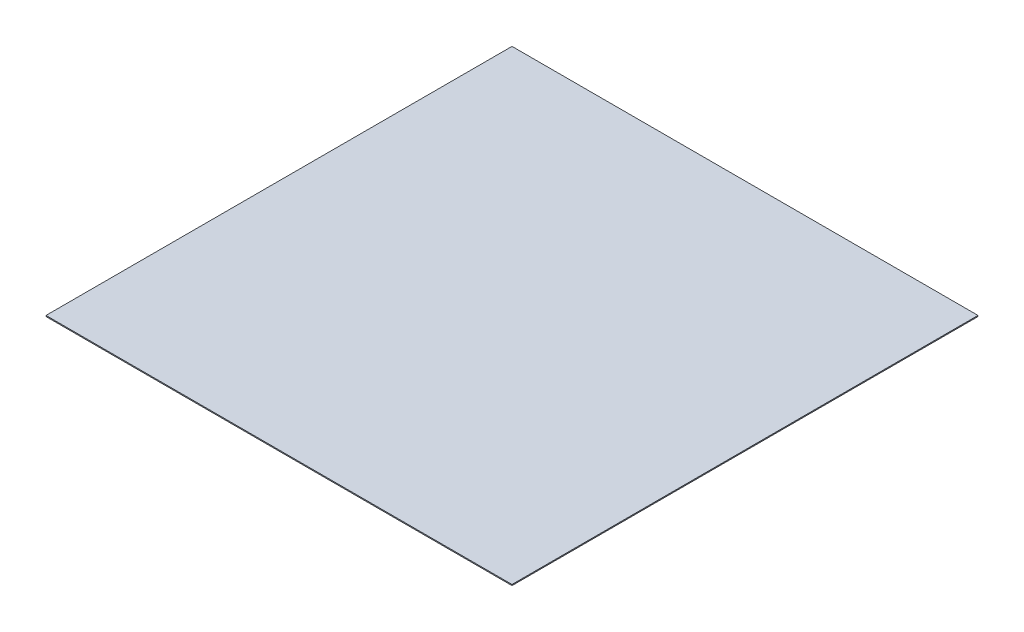
ISO-10303-21;
HEADER;
FILE_DESCRIPTION(('STEP AP214'),'2;1');
FILE_NAME('part.step','',(''),(''),'','','');
FILE_SCHEMA(('AUTOMOTIVE_DESIGN { 1 0 10303 214 1 1 1 1 }'));
ENDSEC;
DATA;
#1=APPLICATION_CONTEXT('core data for automotive mechanical design processes');
#2=APPLICATION_PROTOCOL_DEFINITION('international standard','automotive_design',2000,#1);
#3=PRODUCT_CONTEXT('',#1,'mechanical');
#4=PRODUCT('Part','Part','',(#3));
#5=PRODUCT_RELATED_PRODUCT_CATEGORY('part','',(#4));
#6=PRODUCT_DEFINITION_FORMATION('','',#4);
#7=PRODUCT_DEFINITION_CONTEXT('part definition',#1,'design');
#8=PRODUCT_DEFINITION('design','',#6,#7);
#9=PRODUCT_DEFINITION_SHAPE('','',#8);
#10=(LENGTH_UNIT() NAMED_UNIT(*) SI_UNIT(.MILLI.,.METRE.));
#11=(NAMED_UNIT(*) PLANE_ANGLE_UNIT() SI_UNIT($,.RADIAN.));
#12=(NAMED_UNIT(*) SI_UNIT($,.STERADIAN.) SOLID_ANGLE_UNIT());
#13=UNCERTAINTY_MEASURE_WITH_UNIT(LENGTH_MEASURE(1.E-05),#10,'distance_accuracy_value','');
#14=(GEOMETRIC_REPRESENTATION_CONTEXT(3) GLOBAL_UNCERTAINTY_ASSIGNED_CONTEXT((#13)) GLOBAL_UNIT_ASSIGNED_CONTEXT((#10,
#11,#12)) REPRESENTATION_CONTEXT('',''));
#15=CARTESIAN_POINT('',(0.,0.,0.));
#16=DIRECTION('',(0.,0.,1.));
#17=DIRECTION('',(1.,0.,0.));
#18=AXIS2_PLACEMENT_3D('',#15,#16,#17);
#19=CARTESIAN_POINT('',(57.,0.125,57.));
#20=DIRECTION('',(-1.,0.,0.));
#21=DIRECTION('',(0.,0.,1.));
#22=AXIS2_PLACEMENT_3D('',#19,#20,#21);
#23=PLANE('',#22);
#24=DIRECTION('',(0.,0.,-1.));
#25=VECTOR('',#24,1.);
#26=CARTESIAN_POINT('',(57.,-0.125,57.));
#27=LINE('',#26,#25);
#28=CARTESIAN_POINT('',(57.,-0.125,57.));
#29=VERTEX_POINT('',#28);
#30=CARTESIAN_POINT('',(57.,-0.125,-57.));
#31=VERTEX_POINT('',#30);
#32=EDGE_CURVE('E96',#29,#31,#27,.T.);
#33=ORIENTED_EDGE('',*,*,#32,.T.);
#34=DIRECTION('',(0.,-1.,0.));
#35=VECTOR('',#34,1.);
#36=CARTESIAN_POINT('',(57.,0.125,-57.));
#37=LINE('',#36,#35);
#38=CARTESIAN_POINT('',(57.,0.125,-57.));
#39=VERTEX_POINT('',#38);
#40=EDGE_CURVE('E11',#39,#31,#37,.T.);
#41=ORIENTED_EDGE('',*,*,#40,.F.);
#42=DIRECTION('',(0.,0.,-1.));
#43=VECTOR('',#42,1.);
#44=CARTESIAN_POINT('',(57.,0.125,57.));
#45=LINE('',#44,#43);
#46=CARTESIAN_POINT('',(57.,0.125,57.));
#47=VERTEX_POINT('',#46);
#48=EDGE_CURVE('E84',#47,#39,#45,.T.);
#49=ORIENTED_EDGE('',*,*,#48,.F.);
#50=DIRECTION('',(0.,-1.,0.));
#51=VECTOR('',#50,1.);
#52=CARTESIAN_POINT('',(57.,0.125,57.));
#53=LINE('',#52,#51);
#54=EDGE_CURVE('E92',#47,#29,#53,.T.);
#55=ORIENTED_EDGE('',*,*,#54,.T.);
#56=EDGE_LOOP('',(#33,#41,#49,#55));
#57=FACE_BOUND('',#56,.T.);
#58=ADVANCED_FACE('F33',(#57),#23,.F.);
#59=CARTESIAN_POINT('',(-57.,0.125,-57.));
#60=DIRECTION('',(0.,0.,1.));
#61=DIRECTION('',(1.,0.,0.));
#62=AXIS2_PLACEMENT_3D('',#59,#60,#61);
#63=PLANE('',#62);
#64=DIRECTION('',(-1.,0.,0.));
#65=VECTOR('',#64,1.);
#66=CARTESIAN_POINT('',(-57.,-0.125,-57.));
#67=LINE('',#66,#65);
#68=CARTESIAN_POINT('',(-57.,-0.125,-57.));
#69=VERTEX_POINT('',#68);
#70=EDGE_CURVE('E88',#31,#69,#67,.T.);
#71=ORIENTED_EDGE('',*,*,#70,.T.);
#72=DIRECTION('',(0.,-1.,0.));
#73=VECTOR('',#72,1.);
#74=CARTESIAN_POINT('',(-57.,0.125,-57.));
#75=LINE('',#74,#73);
#76=CARTESIAN_POINT('',(-57.,0.125,-57.));
#77=VERTEX_POINT('',#76);
#78=EDGE_CURVE('E41',#77,#69,#75,.T.);
#79=ORIENTED_EDGE('',*,*,#78,.F.);
#80=DIRECTION('',(-1.,0.,0.));
#81=VECTOR('',#80,1.);
#82=CARTESIAN_POINT('',(-57.,0.125,-57.));
#83=LINE('',#82,#81);
#84=EDGE_CURVE('E79',#39,#77,#83,.T.);
#85=ORIENTED_EDGE('',*,*,#84,.F.);
#86=ORIENTED_EDGE('',*,*,#40,.T.);
#87=EDGE_LOOP('',(#71,#79,#85,#86));
#88=FACE_BOUND('',#87,.T.);
#89=ADVANCED_FACE('F87',(#88),#63,.F.);
#90=CARTESIAN_POINT('',(-57.,0.125,57.));
#91=DIRECTION('',(1.,0.,0.));
#92=DIRECTION('',(0.,0.,-1.));
#93=AXIS2_PLACEMENT_3D('',#90,#91,#92);
#94=PLANE('',#93);
#95=DIRECTION('',(0.,0.,1.));
#96=VECTOR('',#95,1.);
#97=CARTESIAN_POINT('',(-57.,-0.125,57.));
#98=LINE('',#97,#96);
#99=CARTESIAN_POINT('',(-57.,-0.125,57.));
#100=VERTEX_POINT('',#99);
#101=EDGE_CURVE('E66',#69,#100,#98,.T.);
#102=ORIENTED_EDGE('',*,*,#101,.T.);
#103=DIRECTION('',(0.,-1.,0.));
#104=VECTOR('',#103,1.);
#105=CARTESIAN_POINT('',(-57.,0.125,57.));
#106=LINE('',#105,#104);
#107=CARTESIAN_POINT('',(-57.,0.125,57.));
#108=VERTEX_POINT('',#107);
#109=EDGE_CURVE('E89',#108,#100,#106,.T.);
#110=ORIENTED_EDGE('',*,*,#109,.F.);
#111=DIRECTION('',(0.,0.,1.));
#112=VECTOR('',#111,1.);
#113=CARTESIAN_POINT('',(-57.,0.125,57.));
#114=LINE('',#113,#112);
#115=EDGE_CURVE('E82',#77,#108,#114,.T.);
#116=ORIENTED_EDGE('',*,*,#115,.F.);
#117=ORIENTED_EDGE('',*,*,#78,.T.);
#118=EDGE_LOOP('',(#102,#110,#116,#117));
#119=FACE_BOUND('',#118,.T.);
#120=ADVANCED_FACE('F90',(#119),#94,.F.);
#121=CARTESIAN_POINT('',(-57.,0.125,57.));
#122=DIRECTION('',(0.,0.,-1.));
#123=DIRECTION('',(-1.,0.,0.));
#124=AXIS2_PLACEMENT_3D('',#121,#122,#123);
#125=PLANE('',#124);
#126=DIRECTION('',(1.,0.,0.));
#127=VECTOR('',#126,1.);
#128=CARTESIAN_POINT('',(-57.,-0.125,57.));
#129=LINE('',#128,#127);
#130=EDGE_CURVE('E72',#100,#29,#129,.T.);
#131=ORIENTED_EDGE('',*,*,#130,.T.);
#132=ORIENTED_EDGE('',*,*,#54,.F.);
#133=DIRECTION('',(1.,0.,0.));
#134=VECTOR('',#133,1.);
#135=CARTESIAN_POINT('',(-57.,0.125,57.));
#136=LINE('',#135,#134);
#137=EDGE_CURVE('E49',#108,#47,#136,.T.);
#138=ORIENTED_EDGE('',*,*,#137,.F.);
#139=ORIENTED_EDGE('',*,*,#109,.T.);
#140=EDGE_LOOP('',(#131,#132,#138,#139));
#141=FACE_BOUND('',#140,.T.);
#142=ADVANCED_FACE('F103',(#141),#125,.F.);
#143=CARTESIAN_POINT('',(0.,0.125,0.));
#144=DIRECTION('',(0.,-1.,0.));
#145=DIRECTION('',(0.,0.,-1.));
#146=AXIS2_PLACEMENT_3D('',#143,#144,#145);
#147=PLANE('',#146);
#148=ORIENTED_EDGE('',*,*,#48,.T.);
#149=ORIENTED_EDGE('',*,*,#84,.T.);
#150=ORIENTED_EDGE('',*,*,#115,.T.);
#151=ORIENTED_EDGE('',*,*,#137,.T.);
#152=EDGE_LOOP('',(#148,#149,#150,#151));
#153=FACE_BOUND('',#152,.T.);
#154=ADVANCED_FACE('F80',(#153),#147,.F.);
#155=CARTESIAN_POINT('',(0.,-0.125,0.));
#156=DIRECTION('',(0.,-1.,0.));
#157=DIRECTION('',(0.,0.,-1.));
#158=AXIS2_PLACEMENT_3D('',#155,#156,#157);
#159=PLANE('',#158);
#160=ORIENTED_EDGE('',*,*,#32,.F.);
#161=ORIENTED_EDGE('',*,*,#130,.F.);
#162=ORIENTED_EDGE('',*,*,#101,.F.);
#163=ORIENTED_EDGE('',*,*,#70,.F.);
#164=EDGE_LOOP('',(#160,#161,#162,#163));
#165=FACE_BOUND('',#164,.T.);
#166=ADVANCED_FACE('F106',(#165),#159,.T.);
#167=CLOSED_SHELL('',(#58,#89,#120,#142,#154,#166));
#168=MANIFOLD_SOLID_BREP('B2',#167);
#169=ADVANCED_BREP_SHAPE_REPRESENTATION('',(#18,#168),#14);
#170=SHAPE_DEFINITION_REPRESENTATION(#9,#169);
ENDSEC;
END-ISO-10303-21;
